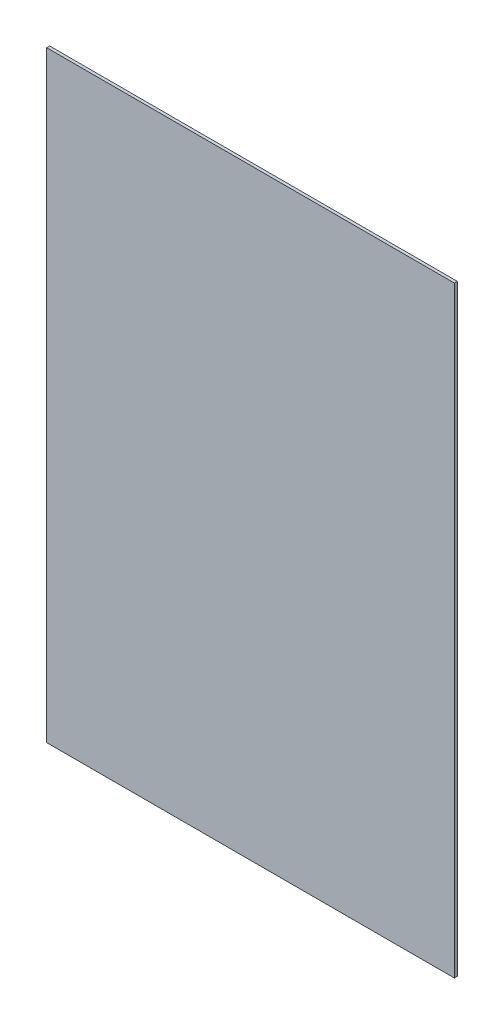
ISO-10303-21;
HEADER;
FILE_DESCRIPTION(('STEP AP214'),'2;1');
FILE_NAME('part.step','',(''),(''),'','','');
FILE_SCHEMA(('AUTOMOTIVE_DESIGN { 1 0 10303 214 1 1 1 1 }'));
ENDSEC;
DATA;
#1=APPLICATION_CONTEXT('core data for automotive mechanical design processes');
#2=APPLICATION_PROTOCOL_DEFINITION('international standard','automotive_design',2000,#1);
#3=PRODUCT_CONTEXT('',#1,'mechanical');
#4=PRODUCT('Part','Part','',(#3));
#5=PRODUCT_RELATED_PRODUCT_CATEGORY('part','',(#4));
#6=PRODUCT_DEFINITION_FORMATION('','',#4);
#7=PRODUCT_DEFINITION_CONTEXT('part definition',#1,'design');
#8=PRODUCT_DEFINITION('design','',#6,#7);
#9=PRODUCT_DEFINITION_SHAPE('','',#8);
#10=(LENGTH_UNIT() NAMED_UNIT(*) SI_UNIT(.MILLI.,.METRE.));
#11=(NAMED_UNIT(*) PLANE_ANGLE_UNIT() SI_UNIT($,.RADIAN.));
#12=(NAMED_UNIT(*) SI_UNIT($,.STERADIAN.) SOLID_ANGLE_UNIT());
#13=UNCERTAINTY_MEASURE_WITH_UNIT(LENGTH_MEASURE(1.E-05),#10,'distance_accuracy_value','');
#14=(GEOMETRIC_REPRESENTATION_CONTEXT(3) GLOBAL_UNCERTAINTY_ASSIGNED_CONTEXT((#13)) GLOBAL_UNIT_ASSIGNED_CONTEXT((#10,
#11,#12)) REPRESENTATION_CONTEXT('',''));
#15=CARTESIAN_POINT('',(0.,0.,0.));
#16=DIRECTION('',(0.,0.,1.));
#17=DIRECTION('',(1.,0.,0.));
#18=AXIS2_PLACEMENT_3D('',#15,#16,#17);
#19=CARTESIAN_POINT('',(-657.996289424861,410.927643784787,10.));
#20=DIRECTION('',(1.,0.,0.));
#21=DIRECTION('',(0.,1.,0.));
#22=AXIS2_PLACEMENT_3D('',#19,#20,#21);
#23=PLANE('',#22);
#24=DIRECTION('',(0.,-1.,0.));
#25=VECTOR('',#24,1.);
#26=CARTESIAN_POINT('',(-657.996289424861,410.927643784787,0.));
#27=LINE('',#26,#25);
#28=CARTESIAN_POINT('',(-657.996289424861,410.927643784787,0.));
#29=VERTEX_POINT('',#28);
#30=CARTESIAN_POINT('',(-657.996289424861,-1626.77235621521,0.));
#31=VERTEX_POINT('',#30);
#32=EDGE_CURVE('E98',#29,#31,#27,.T.);
#33=ORIENTED_EDGE('',*,*,#32,.T.);
#34=DIRECTION('',(0.,0.,-1.));
#35=VECTOR('',#34,1.);
#36=CARTESIAN_POINT('',(-657.996289424861,-1626.77235621521,10.));
#37=LINE('',#36,#35);
#38=CARTESIAN_POINT('',(-657.996289424861,-1626.77235621521,10.));
#39=VERTEX_POINT('',#38);
#40=EDGE_CURVE('E11',#39,#31,#37,.T.);
#41=ORIENTED_EDGE('',*,*,#40,.F.);
#42=DIRECTION('',(0.,-1.,0.));
#43=VECTOR('',#42,1.);
#44=CARTESIAN_POINT('',(-657.996289424861,410.927643784787,10.));
#45=LINE('',#44,#43);
#46=CARTESIAN_POINT('',(-657.996289424861,410.927643784787,10.));
#47=VERTEX_POINT('',#46);
#48=EDGE_CURVE('E86',#47,#39,#45,.T.);
#49=ORIENTED_EDGE('',*,*,#48,.F.);
#50=DIRECTION('',(0.,0.,-1.));
#51=VECTOR('',#50,1.);
#52=CARTESIAN_POINT('',(-657.996289424861,410.927643784787,10.));
#53=LINE('',#52,#51);
#54=EDGE_CURVE('E94',#47,#29,#53,.T.);
#55=ORIENTED_EDGE('',*,*,#54,.T.);
#56=EDGE_LOOP('',(#33,#41,#49,#55));
#57=FACE_BOUND('',#56,.T.);
#58=ADVANCED_FACE('F35',(#57),#23,.F.);
#59=CARTESIAN_POINT('',(-657.996289424861,-1626.77235621521,10.));
#60=DIRECTION('',(0.,1.,0.));
#61=DIRECTION('',(0.,0.,1.));
#62=AXIS2_PLACEMENT_3D('',#59,#60,#61);
#63=PLANE('',#62);
#64=DIRECTION('',(1.,0.,0.));
#65=VECTOR('',#64,1.);
#66=CARTESIAN_POINT('',(-657.996289424861,-1626.77235621521,0.));
#67=LINE('',#66,#65);
#68=CARTESIAN_POINT('',(722.003710575139,-1626.77235621521,0.));
#69=VERTEX_POINT('',#68);
#70=EDGE_CURVE('E90',#31,#69,#67,.T.);
#71=ORIENTED_EDGE('',*,*,#70,.T.);
#72=DIRECTION('',(0.,0.,-1.));
#73=VECTOR('',#72,1.);
#74=CARTESIAN_POINT('',(722.003710575139,-1626.77235621521,10.));
#75=LINE('',#74,#73);
#76=CARTESIAN_POINT('',(722.003710575139,-1626.77235621521,10.));
#77=VERTEX_POINT('',#76);
#78=EDGE_CURVE('E43',#77,#69,#75,.T.);
#79=ORIENTED_EDGE('',*,*,#78,.F.);
#80=DIRECTION('',(1.,0.,0.));
#81=VECTOR('',#80,1.);
#82=CARTESIAN_POINT('',(-657.996289424861,-1626.77235621521,10.));
#83=LINE('',#82,#81);
#84=EDGE_CURVE('E81',#39,#77,#83,.T.);
#85=ORIENTED_EDGE('',*,*,#84,.F.);
#86=ORIENTED_EDGE('',*,*,#40,.T.);
#87=EDGE_LOOP('',(#71,#79,#85,#86));
#88=FACE_BOUND('',#87,.T.);
#89=ADVANCED_FACE('F89',(#88),#63,.F.);
#90=CARTESIAN_POINT('',(722.003710575139,410.927643784787,10.));
#91=DIRECTION('',(-1.,0.,0.));
#92=DIRECTION('',(0.,0.,1.));
#93=AXIS2_PLACEMENT_3D('',#90,#91,#92);
#94=PLANE('',#93);
#95=DIRECTION('',(0.,1.,0.));
#96=VECTOR('',#95,1.);
#97=CARTESIAN_POINT('',(722.003710575139,410.927643784787,0.));
#98=LINE('',#97,#96);
#99=CARTESIAN_POINT('',(722.003710575139,410.927643784787,0.));
#100=VERTEX_POINT('',#99);
#101=EDGE_CURVE('E68',#69,#100,#98,.T.);
#102=ORIENTED_EDGE('',*,*,#101,.T.);
#103=DIRECTION('',(0.,0.,-1.));
#104=VECTOR('',#103,1.);
#105=CARTESIAN_POINT('',(722.003710575139,410.927643784787,10.));
#106=LINE('',#105,#104);
#107=CARTESIAN_POINT('',(722.003710575139,410.927643784787,10.));
#108=VERTEX_POINT('',#107);
#109=EDGE_CURVE('E91',#108,#100,#106,.T.);
#110=ORIENTED_EDGE('',*,*,#109,.F.);
#111=DIRECTION('',(0.,1.,0.));
#112=VECTOR('',#111,1.);
#113=CARTESIAN_POINT('',(722.003710575139,410.927643784787,10.));
#114=LINE('',#113,#112);
#115=EDGE_CURVE('E84',#77,#108,#114,.T.);
#116=ORIENTED_EDGE('',*,*,#115,.F.);
#117=ORIENTED_EDGE('',*,*,#78,.T.);
#118=EDGE_LOOP('',(#102,#110,#116,#117));
#119=FACE_BOUND('',#118,.T.);
#120=ADVANCED_FACE('F92',(#119),#94,.F.);
#121=CARTESIAN_POINT('',(-657.996289424861,410.927643784787,10.));
#122=DIRECTION('',(0.,-1.,0.));
#123=DIRECTION('',(0.,0.,-1.));
#124=AXIS2_PLACEMENT_3D('',#121,#122,#123);
#125=PLANE('',#124);
#126=DIRECTION('',(-1.,0.,0.));
#127=VECTOR('',#126,1.);
#128=CARTESIAN_POINT('',(-657.996289424861,410.927643784787,0.));
#129=LINE('',#128,#127);
#130=EDGE_CURVE('E74',#100,#29,#129,.T.);
#131=ORIENTED_EDGE('',*,*,#130,.T.);
#132=ORIENTED_EDGE('',*,*,#54,.F.);
#133=DIRECTION('',(-1.,0.,0.));
#134=VECTOR('',#133,1.);
#135=CARTESIAN_POINT('',(-657.996289424861,410.927643784787,10.));
#136=LINE('',#135,#134);
#137=EDGE_CURVE('E51',#108,#47,#136,.T.);
#138=ORIENTED_EDGE('',*,*,#137,.F.);
#139=ORIENTED_EDGE('',*,*,#109,.T.);
#140=EDGE_LOOP('',(#131,#132,#138,#139));
#141=FACE_BOUND('',#140,.T.);
#142=ADVANCED_FACE('F105',(#141),#125,.F.);
#143=CARTESIAN_POINT('',(0.,0.,10.));
#144=DIRECTION('',(0.,0.,1.));
#145=DIRECTION('',(1.,0.,0.));
#146=AXIS2_PLACEMENT_3D('',#143,#144,#145);
#147=PLANE('',#146);
#148=ORIENTED_EDGE('',*,*,#48,.T.);
#149=ORIENTED_EDGE('',*,*,#84,.T.);
#150=ORIENTED_EDGE('',*,*,#115,.T.);
#151=ORIENTED_EDGE('',*,*,#137,.T.);
#152=EDGE_LOOP('',(#148,#149,#150,#151));
#153=FACE_BOUND('',#152,.T.);
#154=ADVANCED_FACE('F82',(#153),#147,.T.);
#155=CARTESIAN_POINT('',(0.,0.,0.));
#156=DIRECTION('',(0.,0.,1.));
#157=DIRECTION('',(1.,0.,0.));
#158=AXIS2_PLACEMENT_3D('',#155,#156,#157);
#159=PLANE('',#158);
#160=ORIENTED_EDGE('',*,*,#32,.F.);
#161=ORIENTED_EDGE('',*,*,#130,.F.);
#162=ORIENTED_EDGE('',*,*,#101,.F.);
#163=ORIENTED_EDGE('',*,*,#70,.F.);
#164=EDGE_LOOP('',(#160,#161,#162,#163));
#165=FACE_BOUND('',#164,.T.);
#166=ADVANCED_FACE('F108',(#165),#159,.F.);
#167=CLOSED_SHELL('',(#58,#89,#120,#142,#154,#166));
#168=MANIFOLD_SOLID_BREP('B2',#167);
#169=ADVANCED_BREP_SHAPE_REPRESENTATION('',(#18,#168),#14);
#170=SHAPE_DEFINITION_REPRESENTATION(#9,#169);
ENDSEC;
END-ISO-10303-21;
